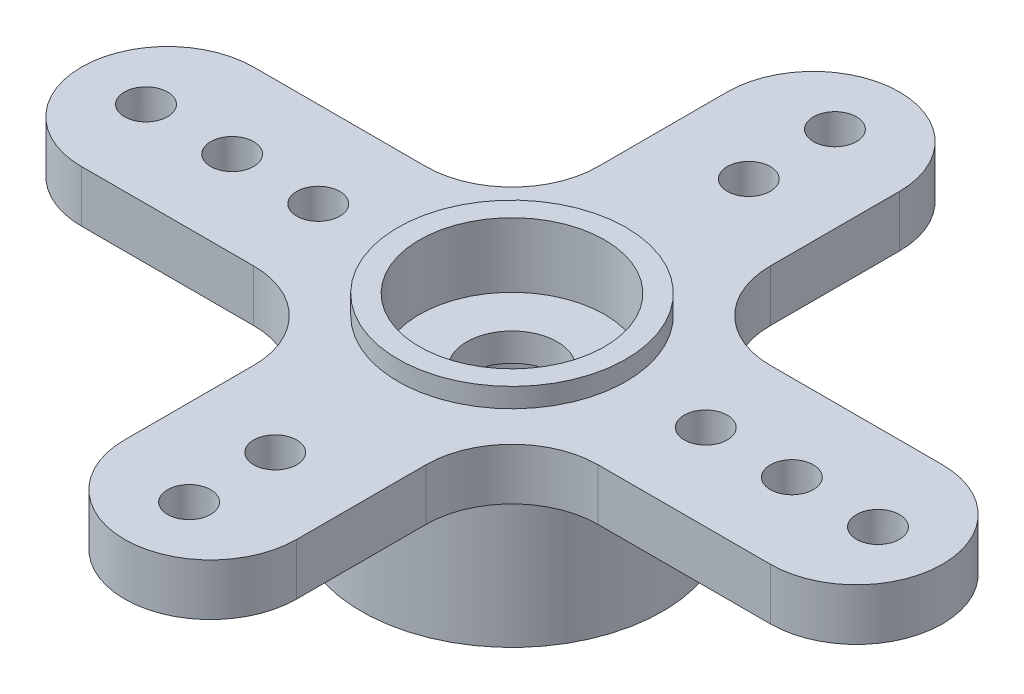
ISO-10303-21;
HEADER;
FILE_DESCRIPTION(('STEP AP214'),'2;1');
FILE_NAME('part.step','',(''),(''),'','','');
FILE_SCHEMA(('AUTOMOTIVE_DESIGN { 1 0 10303 214 1 1 1 1 }'));
ENDSEC;
DATA;
#1=APPLICATION_CONTEXT('core data for automotive mechanical design processes');
#2=APPLICATION_PROTOCOL_DEFINITION('international standard','automotive_design',2000,#1);
#3=PRODUCT_CONTEXT('',#1,'mechanical');
#4=PRODUCT('Part','Part','',(#3));
#5=PRODUCT_RELATED_PRODUCT_CATEGORY('part','',(#4));
#6=PRODUCT_DEFINITION_FORMATION('','',#4);
#7=PRODUCT_DEFINITION_CONTEXT('part definition',#1,'design');
#8=PRODUCT_DEFINITION('design','',#6,#7);
#9=PRODUCT_DEFINITION_SHAPE('','',#8);
#10=(LENGTH_UNIT() NAMED_UNIT(*) SI_UNIT(.MILLI.,.METRE.));
#11=(NAMED_UNIT(*) PLANE_ANGLE_UNIT() SI_UNIT($,.RADIAN.));
#12=(NAMED_UNIT(*) SI_UNIT($,.STERADIAN.) SOLID_ANGLE_UNIT());
#13=UNCERTAINTY_MEASURE_WITH_UNIT(LENGTH_MEASURE(1.E-05),#10,'distance_accuracy_value','');
#14=(GEOMETRIC_REPRESENTATION_CONTEXT(3) GLOBAL_UNCERTAINTY_ASSIGNED_CONTEXT((#13)) GLOBAL_UNIT_ASSIGNED_CONTEXT((#10,
#11,#12)) REPRESENTATION_CONTEXT('',''));
#15=CARTESIAN_POINT('',(0.,0.,0.));
#16=DIRECTION('',(0.,0.,1.));
#17=DIRECTION('',(1.,0.,0.));
#18=AXIS2_PLACEMENT_3D('',#15,#16,#17);
#19=CARTESIAN_POINT('',(3.5,0.500000000000001,0.));
#20=DIRECTION('',(0.,-1.,0.));
#21=DIRECTION('',(0.,0.,-1.));
#22=AXIS2_PLACEMENT_3D('',#19,#20,#21);
#23=PLANE('',#22);
#24=CARTESIAN_POINT('',(0.,0.5,0.));
#25=DIRECTION('',(0.,-1.,0.));
#26=DIRECTION('',(0.,0.,-1.));
#27=AXIS2_PLACEMENT_3D('',#24,#25,#26);
#28=CIRCLE('',#27,3.5);
#29=CARTESIAN_POINT('',(0.,0.5,-3.5));
#30=VERTEX_POINT('',#29);
#31=EDGE_CURVE('E213',#30,#30,#28,.T.);
#32=ORIENTED_EDGE('',*,*,#31,.F.);
#33=EDGE_LOOP('',(#32));
#34=FACE_BOUND('',#33,.T.);
#35=CARTESIAN_POINT('',(-6.5,0.500000000000001,0.));
#36=DIRECTION('',(0.,-1.,0.));
#37=DIRECTION('',(0.,0.,-1.));
#38=AXIS2_PLACEMENT_3D('',#35,#36,#37);
#39=CIRCLE('',#38,0.499999999999929);
#40=CARTESIAN_POINT('',(-6.5,0.500000000000001,-0.499999999999929));
#41=VERTEX_POINT('',#40);
#42=EDGE_CURVE('E237',#41,#41,#39,.T.);
#43=ORIENTED_EDGE('',*,*,#42,.F.);
#44=EDGE_LOOP('',(#43));
#45=FACE_BOUND('',#44,.T.);
#46=CARTESIAN_POINT('',(-4.5,0.500000000000001,0.));
#47=DIRECTION('',(0.,-1.,0.));
#48=DIRECTION('',(0.,0.,-1.));
#49=AXIS2_PLACEMENT_3D('',#46,#47,#48);
#50=CIRCLE('',#49,0.499999999999929);
#51=CARTESIAN_POINT('',(-4.5,0.500000000000001,-0.499999999999929));
#52=VERTEX_POINT('',#51);
#53=EDGE_CURVE('E243',#52,#52,#50,.T.);
#54=ORIENTED_EDGE('',*,*,#53,.F.);
#55=EDGE_LOOP('',(#54));
#56=FACE_BOUND('',#55,.T.);
#57=CARTESIAN_POINT('',(-8.5,0.500000000000001,0.));
#58=DIRECTION('',(0.,-1.,0.));
#59=DIRECTION('',(0.,0.,-1.));
#60=AXIS2_PLACEMENT_3D('',#57,#58,#59);
#61=CIRCLE('',#60,0.499999999999928);
#62=CARTESIAN_POINT('',(-8.5,0.500000000000001,-0.499999999999928));
#63=VERTEX_POINT('',#62);
#64=EDGE_CURVE('E249',#63,#63,#61,.T.);
#65=ORIENTED_EDGE('',*,*,#64,.F.);
#66=EDGE_LOOP('',(#65));
#67=FACE_BOUND('',#66,.T.);
#68=CARTESIAN_POINT('',(6.5,0.500000000000001,0.));
#69=DIRECTION('',(0.,-1.,0.));
#70=DIRECTION('',(0.,0.,-1.));
#71=AXIS2_PLACEMENT_3D('',#68,#69,#70);
#72=CIRCLE('',#71,0.499999999999929);
#73=CARTESIAN_POINT('',(6.5,0.500000000000001,-0.499999999999929));
#74=VERTEX_POINT('',#73);
#75=EDGE_CURVE('E255',#74,#74,#72,.T.);
#76=ORIENTED_EDGE('',*,*,#75,.F.);
#77=EDGE_LOOP('',(#76));
#78=FACE_BOUND('',#77,.T.);
#79=CARTESIAN_POINT('',(4.5,0.500000000000001,0.));
#80=DIRECTION('',(0.,-1.,0.));
#81=DIRECTION('',(0.,0.,-1.));
#82=AXIS2_PLACEMENT_3D('',#79,#80,#81);
#83=CIRCLE('',#82,0.499999999999929);
#84=CARTESIAN_POINT('',(4.5,0.500000000000001,-0.499999999999929));
#85=VERTEX_POINT('',#84);
#86=EDGE_CURVE('E261',#85,#85,#83,.T.);
#87=ORIENTED_EDGE('',*,*,#86,.F.);
#88=EDGE_LOOP('',(#87));
#89=FACE_BOUND('',#88,.T.);
#90=CARTESIAN_POINT('',(8.5,0.500000000000001,0.));
#91=DIRECTION('',(0.,-1.,0.));
#92=DIRECTION('',(0.,0.,-1.));
#93=AXIS2_PLACEMENT_3D('',#90,#91,#92);
#94=CIRCLE('',#93,0.499999999999928);
#95=CARTESIAN_POINT('',(8.5,0.500000000000001,-0.499999999999928));
#96=VERTEX_POINT('',#95);
#97=EDGE_CURVE('E267',#96,#96,#94,.T.);
#98=ORIENTED_EDGE('',*,*,#97,.F.);
#99=EDGE_LOOP('',(#98));
#100=FACE_BOUND('',#99,.T.);
#101=CARTESIAN_POINT('',(0.,0.500000000000001,-7.5));
#102=DIRECTION('',(0.,-1.,0.));
#103=DIRECTION('',(0.,0.,-1.));
#104=AXIS2_PLACEMENT_3D('',#101,#102,#103);
#105=CIRCLE('',#104,0.499999999999966);
#106=CARTESIAN_POINT('',(0.,0.500000000000001,-7.99999999999997));
#107=VERTEX_POINT('',#106);
#108=EDGE_CURVE('E273',#107,#107,#105,.T.);
#109=ORIENTED_EDGE('',*,*,#108,.F.);
#110=EDGE_LOOP('',(#109));
#111=FACE_BOUND('',#110,.T.);
#112=CARTESIAN_POINT('',(0.,0.500000000000001,-5.5));
#113=DIRECTION('',(0.,-1.,0.));
#114=DIRECTION('',(0.,0.,-1.));
#115=AXIS2_PLACEMENT_3D('',#112,#113,#114);
#116=CIRCLE('',#115,0.499999999999966);
#117=CARTESIAN_POINT('',(0.,0.500000000000001,-5.99999999999997));
#118=VERTEX_POINT('',#117);
#119=EDGE_CURVE('E279',#118,#118,#116,.T.);
#120=ORIENTED_EDGE('',*,*,#119,.F.);
#121=EDGE_LOOP('',(#120));
#122=FACE_BOUND('',#121,.T.);
#123=CARTESIAN_POINT('',(0.,0.500000000000001,7.5));
#124=DIRECTION('',(0.,-1.,0.));
#125=DIRECTION('',(0.,0.,-1.));
#126=AXIS2_PLACEMENT_3D('',#123,#124,#125);
#127=CIRCLE('',#126,0.499999999999966);
#128=CARTESIAN_POINT('',(0.,0.500000000000001,7.00000000000003));
#129=VERTEX_POINT('',#128);
#130=EDGE_CURVE('E285',#129,#129,#127,.T.);
#131=ORIENTED_EDGE('',*,*,#130,.F.);
#132=EDGE_LOOP('',(#131));
#133=FACE_BOUND('',#132,.T.);
#134=CARTESIAN_POINT('',(0.,0.500000000000001,5.5));
#135=DIRECTION('',(0.,-1.,0.));
#136=DIRECTION('',(0.,0.,-1.));
#137=AXIS2_PLACEMENT_3D('',#134,#135,#136);
#138=CIRCLE('',#137,0.499999999999966);
#139=CARTESIAN_POINT('',(0.,0.500000000000001,5.00000000000003));
#140=VERTEX_POINT('',#139);
#141=EDGE_CURVE('E291',#140,#140,#138,.T.);
#142=ORIENTED_EDGE('',*,*,#141,.F.);
#143=EDGE_LOOP('',(#142));
#144=FACE_BOUND('',#143,.T.);
#145=DIRECTION('',(-1.,0.,0.));
#146=VECTOR('',#145,1.);
#147=CARTESIAN_POINT('',(3.5,0.500000000000001,2.));
#148=LINE('',#147,#146);
#149=CARTESIAN_POINT('',(8.,0.5,2.));
#150=VERTEX_POINT('',#149);
#151=CARTESIAN_POINT('',(4.,0.500000000000001,2.));
#152=VERTEX_POINT('',#151);
#153=EDGE_CURVE('E340',#150,#152,#148,.T.);
#154=ORIENTED_EDGE('',*,*,#153,.T.);
#155=CARTESIAN_POINT('',(4.,0.5,4.));
#156=DIRECTION('',(0.,-1.,0.));
#157=DIRECTION('',(0.,0.,-1.));
#158=AXIS2_PLACEMENT_3D('',#155,#156,#157);
#159=CIRCLE('',#158,2.);
#160=CARTESIAN_POINT('',(2.,0.5,4.));
#161=VERTEX_POINT('',#160);
#162=EDGE_CURVE('E162',#152,#161,#159,.F.);
#163=ORIENTED_EDGE('',*,*,#162,.T.);
#164=DIRECTION('',(0.,0.,1.));
#165=VECTOR('',#164,1.);
#166=CARTESIAN_POINT('',(2.,0.500000000000001,0.));
#167=LINE('',#166,#165);
#168=CARTESIAN_POINT('',(2.,0.5,7.));
#169=VERTEX_POINT('',#168);
#170=EDGE_CURVE('E298',#161,#169,#167,.T.);
#171=ORIENTED_EDGE('',*,*,#170,.T.);
#172=CARTESIAN_POINT('',(0.,0.5,7.));
#173=DIRECTION('',(0.,-1.,0.));
#174=DIRECTION('',(0.,0.,-1.));
#175=AXIS2_PLACEMENT_3D('',#172,#173,#174);
#176=CIRCLE('',#175,2.);
#177=CARTESIAN_POINT('',(-2.,0.5,7.));
#178=VERTEX_POINT('',#177);
#179=EDGE_CURVE('E301',#169,#178,#176,.T.);
#180=ORIENTED_EDGE('',*,*,#179,.T.);
#181=DIRECTION('',(0.,0.,-1.));
#182=VECTOR('',#181,1.);
#183=CARTESIAN_POINT('',(-2.,0.500000000000001,0.));
#184=LINE('',#183,#182);
#185=CARTESIAN_POINT('',(-2.,0.5,4.));
#186=VERTEX_POINT('',#185);
#187=EDGE_CURVE('E304',#178,#186,#184,.T.);
#188=ORIENTED_EDGE('',*,*,#187,.T.);
#189=CARTESIAN_POINT('',(-4.,0.5,4.));
#190=DIRECTION('',(0.,-1.,0.));
#191=DIRECTION('',(0.,0.,-1.));
#192=AXIS2_PLACEMENT_3D('',#189,#190,#191);
#193=CIRCLE('',#192,2.);
#194=CARTESIAN_POINT('',(-4.,0.5,2.));
#195=VERTEX_POINT('',#194);
#196=EDGE_CURVE('E307',#186,#195,#193,.F.);
#197=ORIENTED_EDGE('',*,*,#196,.T.);
#198=DIRECTION('',(-1.,0.,0.));
#199=VECTOR('',#198,1.);
#200=CARTESIAN_POINT('',(3.5,0.500000000000001,2.));
#201=LINE('',#200,#199);
#202=CARTESIAN_POINT('',(-8.,0.5,2.));
#203=VERTEX_POINT('',#202);
#204=EDGE_CURVE('E310',#195,#203,#201,.T.);
#205=ORIENTED_EDGE('',*,*,#204,.T.);
#206=CARTESIAN_POINT('',(-8.,0.5,0.));
#207=DIRECTION('',(0.,-1.,0.));
#208=DIRECTION('',(0.,0.,-1.));
#209=AXIS2_PLACEMENT_3D('',#206,#207,#208);
#210=CIRCLE('',#209,2.);
#211=CARTESIAN_POINT('',(-8.,0.5,-2.));
#212=VERTEX_POINT('',#211);
#213=EDGE_CURVE('E313',#203,#212,#210,.T.);
#214=ORIENTED_EDGE('',*,*,#213,.T.);
#215=DIRECTION('',(1.,0.,0.));
#216=VECTOR('',#215,1.);
#217=CARTESIAN_POINT('',(3.5,0.500000000000001,-2.));
#218=LINE('',#217,#216);
#219=CARTESIAN_POINT('',(-4.,0.5,-2.));
#220=VERTEX_POINT('',#219);
#221=EDGE_CURVE('E316',#212,#220,#218,.T.);
#222=ORIENTED_EDGE('',*,*,#221,.T.);
#223=CARTESIAN_POINT('',(-4.,0.5,-4.));
#224=DIRECTION('',(0.,-1.,0.));
#225=DIRECTION('',(0.,0.,-1.));
#226=AXIS2_PLACEMENT_3D('',#223,#224,#225);
#227=CIRCLE('',#226,2.);
#228=CARTESIAN_POINT('',(-2.,0.5,-4.));
#229=VERTEX_POINT('',#228);
#230=EDGE_CURVE('E319',#220,#229,#227,.F.);
#231=ORIENTED_EDGE('',*,*,#230,.T.);
#232=DIRECTION('',(0.,0.,-1.));
#233=VECTOR('',#232,1.);
#234=CARTESIAN_POINT('',(-2.,0.500000000000001,0.));
#235=LINE('',#234,#233);
#236=CARTESIAN_POINT('',(-2.,0.5,-7.));
#237=VERTEX_POINT('',#236);
#238=EDGE_CURVE('E322',#229,#237,#235,.T.);
#239=ORIENTED_EDGE('',*,*,#238,.T.);
#240=CARTESIAN_POINT('',(0.,0.5,-7.));
#241=DIRECTION('',(0.,-1.,0.));
#242=DIRECTION('',(0.,0.,-1.));
#243=AXIS2_PLACEMENT_3D('',#240,#241,#242);
#244=CIRCLE('',#243,2.);
#245=CARTESIAN_POINT('',(2.,0.5,-7.));
#246=VERTEX_POINT('',#245);
#247=EDGE_CURVE('E325',#237,#246,#244,.T.);
#248=ORIENTED_EDGE('',*,*,#247,.T.);
#249=DIRECTION('',(0.,0.,1.));
#250=VECTOR('',#249,1.);
#251=CARTESIAN_POINT('',(2.,0.500000000000001,0.));
#252=LINE('',#251,#250);
#253=CARTESIAN_POINT('',(2.,0.5,-4.));
#254=VERTEX_POINT('',#253);
#255=EDGE_CURVE('E328',#246,#254,#252,.T.);
#256=ORIENTED_EDGE('',*,*,#255,.T.);
#257=CARTESIAN_POINT('',(4.,0.5,-4.));
#258=DIRECTION('',(0.,-1.,0.));
#259=DIRECTION('',(0.,0.,-1.));
#260=AXIS2_PLACEMENT_3D('',#257,#258,#259);
#261=CIRCLE('',#260,2.);
#262=CARTESIAN_POINT('',(4.,0.5,-2.));
#263=VERTEX_POINT('',#262);
#264=EDGE_CURVE('E331',#254,#263,#261,.F.);
#265=ORIENTED_EDGE('',*,*,#264,.T.);
#266=DIRECTION('',(1.,0.,0.));
#267=VECTOR('',#266,1.);
#268=CARTESIAN_POINT('',(3.5,0.500000000000001,-2.));
#269=LINE('',#268,#267);
#270=CARTESIAN_POINT('',(8.,0.5,-2.));
#271=VERTEX_POINT('',#270);
#272=EDGE_CURVE('E334',#263,#271,#269,.T.);
#273=ORIENTED_EDGE('',*,*,#272,.T.);
#274=CARTESIAN_POINT('',(8.,0.5,0.));
#275=DIRECTION('',(0.,-1.,0.));
#276=DIRECTION('',(0.,0.,-1.));
#277=AXIS2_PLACEMENT_3D('',#274,#275,#276);
#278=CIRCLE('',#277,2.);
#279=EDGE_CURVE('E337',#271,#150,#278,.T.);
#280=ORIENTED_EDGE('',*,*,#279,.T.);
#281=EDGE_LOOP('',(#154,#163,#171,#180,#188,#197,#205,#214,#222,#231,#239,#248,#256,#265,#273,#280));
#282=FACE_BOUND('',#281,.T.);
#283=ADVANCED_FACE('F40',(#34,#45,#56,#67,#78,#89,#100,#111,#122,#133,#144,#282),#23,.T.);
#284=CARTESIAN_POINT('',(25.,1.7,0.));
#285=DIRECTION('',(0.,1.,0.));
#286=DIRECTION('',(0.,0.,1.));
#287=AXIS2_PLACEMENT_3D('',#284,#285,#286);
#288=PLANE('',#287);
#289=CARTESIAN_POINT('',(0.,1.7,0.));
#290=DIRECTION('',(0.,-1.,0.));
#291=DIRECTION('',(0.,0.,-1.));
#292=AXIS2_PLACEMENT_3D('',#289,#290,#291);
#293=CIRCLE('',#292,2.65);
#294=CARTESIAN_POINT('',(0.,1.7,-2.65));
#295=VERTEX_POINT('',#294);
#296=EDGE_CURVE('E216',#295,#295,#293,.T.);
#297=ORIENTED_EDGE('',*,*,#296,.T.);
#298=EDGE_LOOP('',(#297));
#299=FACE_BOUND('',#298,.T.);
#300=CARTESIAN_POINT('',(-6.5,1.7,0.));
#301=DIRECTION('',(0.,1.,0.));
#302=DIRECTION('',(0.,0.,1.));
#303=AXIS2_PLACEMENT_3D('',#300,#301,#302);
#304=CIRCLE('',#303,0.499999999999953);
#305=CARTESIAN_POINT('',(-6.5,1.7,0.499999999999953));
#306=VERTEX_POINT('',#305);
#307=EDGE_CURVE('E240',#306,#306,#304,.T.);
#308=ORIENTED_EDGE('',*,*,#307,.F.);
#309=EDGE_LOOP('',(#308));
#310=FACE_BOUND('',#309,.T.);
#311=CARTESIAN_POINT('',(-4.5,1.7,0.));
#312=DIRECTION('',(0.,1.,0.));
#313=DIRECTION('',(0.,0.,1.));
#314=AXIS2_PLACEMENT_3D('',#311,#312,#313);
#315=CIRCLE('',#314,0.499999999999953);
#316=CARTESIAN_POINT('',(-4.5,1.7,0.499999999999953));
#317=VERTEX_POINT('',#316);
#318=EDGE_CURVE('E246',#317,#317,#315,.T.);
#319=ORIENTED_EDGE('',*,*,#318,.F.);
#320=EDGE_LOOP('',(#319));
#321=FACE_BOUND('',#320,.T.);
#322=CARTESIAN_POINT('',(-8.5,1.7,0.));
#323=DIRECTION('',(0.,1.,0.));
#324=DIRECTION('',(0.,0.,1.));
#325=AXIS2_PLACEMENT_3D('',#322,#323,#324);
#326=CIRCLE('',#325,0.499999999999952);
#327=CARTESIAN_POINT('',(-8.5,1.7,0.499999999999952));
#328=VERTEX_POINT('',#327);
#329=EDGE_CURVE('E252',#328,#328,#326,.T.);
#330=ORIENTED_EDGE('',*,*,#329,.F.);
#331=EDGE_LOOP('',(#330));
#332=FACE_BOUND('',#331,.T.);
#333=CARTESIAN_POINT('',(6.5,1.7,0.));
#334=DIRECTION('',(0.,1.,0.));
#335=DIRECTION('',(0.,0.,1.));
#336=AXIS2_PLACEMENT_3D('',#333,#334,#335);
#337=CIRCLE('',#336,0.499999999999953);
#338=CARTESIAN_POINT('',(6.5,1.7,0.499999999999953));
#339=VERTEX_POINT('',#338);
#340=EDGE_CURVE('E258',#339,#339,#337,.T.);
#341=ORIENTED_EDGE('',*,*,#340,.F.);
#342=EDGE_LOOP('',(#341));
#343=FACE_BOUND('',#342,.T.);
#344=CARTESIAN_POINT('',(4.5,1.7,0.));
#345=DIRECTION('',(0.,1.,0.));
#346=DIRECTION('',(0.,0.,1.));
#347=AXIS2_PLACEMENT_3D('',#344,#345,#346);
#348=CIRCLE('',#347,0.499999999999953);
#349=CARTESIAN_POINT('',(4.5,1.7,0.499999999999953));
#350=VERTEX_POINT('',#349);
#351=EDGE_CURVE('E264',#350,#350,#348,.T.);
#352=ORIENTED_EDGE('',*,*,#351,.F.);
#353=EDGE_LOOP('',(#352));
#354=FACE_BOUND('',#353,.T.);
#355=CARTESIAN_POINT('',(8.5,1.7,0.));
#356=DIRECTION('',(0.,1.,0.));
#357=DIRECTION('',(0.,0.,1.));
#358=AXIS2_PLACEMENT_3D('',#355,#356,#357);
#359=CIRCLE('',#358,0.499999999999952);
#360=CARTESIAN_POINT('',(8.5,1.7,0.499999999999952));
#361=VERTEX_POINT('',#360);
#362=EDGE_CURVE('E270',#361,#361,#359,.T.);
#363=ORIENTED_EDGE('',*,*,#362,.F.);
#364=EDGE_LOOP('',(#363));
#365=FACE_BOUND('',#364,.T.);
#366=CARTESIAN_POINT('',(0.,1.7,-7.5));
#367=DIRECTION('',(0.,1.,0.));
#368=DIRECTION('',(0.,0.,1.));
#369=AXIS2_PLACEMENT_3D('',#366,#367,#368);
#370=CIRCLE('',#369,0.49999999999999);
#371=CARTESIAN_POINT('',(0.,1.7,-7.00000000000001));
#372=VERTEX_POINT('',#371);
#373=EDGE_CURVE('E276',#372,#372,#370,.T.);
#374=ORIENTED_EDGE('',*,*,#373,.F.);
#375=EDGE_LOOP('',(#374));
#376=FACE_BOUND('',#375,.T.);
#377=CARTESIAN_POINT('',(0.,1.7,-5.5));
#378=DIRECTION('',(0.,1.,0.));
#379=DIRECTION('',(0.,0.,1.));
#380=AXIS2_PLACEMENT_3D('',#377,#378,#379);
#381=CIRCLE('',#380,0.49999999999999);
#382=CARTESIAN_POINT('',(0.,1.7,-5.00000000000001));
#383=VERTEX_POINT('',#382);
#384=EDGE_CURVE('E282',#383,#383,#381,.T.);
#385=ORIENTED_EDGE('',*,*,#384,.F.);
#386=EDGE_LOOP('',(#385));
#387=FACE_BOUND('',#386,.T.);
#388=CARTESIAN_POINT('',(0.,1.7,7.5));
#389=DIRECTION('',(0.,1.,0.));
#390=DIRECTION('',(0.,0.,1.));
#391=AXIS2_PLACEMENT_3D('',#388,#389,#390);
#392=CIRCLE('',#391,0.49999999999999);
#393=CARTESIAN_POINT('',(0.,1.7,7.99999999999999));
#394=VERTEX_POINT('',#393);
#395=EDGE_CURVE('E288',#394,#394,#392,.T.);
#396=ORIENTED_EDGE('',*,*,#395,.F.);
#397=EDGE_LOOP('',(#396));
#398=FACE_BOUND('',#397,.T.);
#399=CARTESIAN_POINT('',(0.,1.7,5.5));
#400=DIRECTION('',(0.,1.,0.));
#401=DIRECTION('',(0.,0.,1.));
#402=AXIS2_PLACEMENT_3D('',#399,#400,#401);
#403=CIRCLE('',#402,0.49999999999999);
#404=CARTESIAN_POINT('',(0.,1.7,5.99999999999999));
#405=VERTEX_POINT('',#404);
#406=EDGE_CURVE('E294',#405,#405,#403,.T.);
#407=ORIENTED_EDGE('',*,*,#406,.F.);
#408=EDGE_LOOP('',(#407));
#409=FACE_BOUND('',#408,.T.);
#410=DIRECTION('',(0.,0.,-1.));
#411=VECTOR('',#410,1.);
#412=CARTESIAN_POINT('',(2.,1.7,0.));
#413=LINE('',#412,#411);
#414=CARTESIAN_POINT('',(2.,1.7,7.));
#415=VERTEX_POINT('',#414);
#416=CARTESIAN_POINT('',(2.,1.7,4.));
#417=VERTEX_POINT('',#416);
#418=EDGE_CURVE('E48',#415,#417,#413,.T.);
#419=ORIENTED_EDGE('',*,*,#418,.T.);
#420=CARTESIAN_POINT('',(4.,1.7,4.));
#421=DIRECTION('',(0.,1.,0.));
#422=DIRECTION('',(0.,0.,1.));
#423=AXIS2_PLACEMENT_3D('',#420,#421,#422);
#424=CIRCLE('',#423,2.);
#425=CARTESIAN_POINT('',(4.,1.7,2.));
#426=VERTEX_POINT('',#425);
#427=EDGE_CURVE('E12',#417,#426,#424,.F.);
#428=ORIENTED_EDGE('',*,*,#427,.T.);
#429=DIRECTION('',(1.,0.,0.));
#430=VECTOR('',#429,1.);
#431=CARTESIAN_POINT('',(25.,1.7,2.00000000000001));
#432=LINE('',#431,#430);
#433=CARTESIAN_POINT('',(8.,1.7,2.));
#434=VERTEX_POINT('',#433);
#435=EDGE_CURVE('E150',#426,#434,#432,.T.);
#436=ORIENTED_EDGE('',*,*,#435,.T.);
#437=CARTESIAN_POINT('',(8.,1.7,0.));
#438=DIRECTION('',(0.,1.,0.));
#439=DIRECTION('',(0.,0.,1.));
#440=AXIS2_PLACEMENT_3D('',#437,#438,#439);
#441=CIRCLE('',#440,2.);
#442=CARTESIAN_POINT('',(8.,1.7,-2.));
#443=VERTEX_POINT('',#442);
#444=EDGE_CURVE('E154',#434,#443,#441,.T.);
#445=ORIENTED_EDGE('',*,*,#444,.T.);
#446=DIRECTION('',(-1.,0.,0.));
#447=VECTOR('',#446,1.);
#448=CARTESIAN_POINT('',(25.,1.7,-2.00000000000001));
#449=LINE('',#448,#447);
#450=CARTESIAN_POINT('',(4.,1.7,-2.));
#451=VERTEX_POINT('',#450);
#452=EDGE_CURVE('E204',#443,#451,#449,.T.);
#453=ORIENTED_EDGE('',*,*,#452,.T.);
#454=CARTESIAN_POINT('',(4.,1.7,-4.));
#455=DIRECTION('',(0.,1.,0.));
#456=DIRECTION('',(0.,0.,1.));
#457=AXIS2_PLACEMENT_3D('',#454,#455,#456);
#458=CIRCLE('',#457,2.);
#459=CARTESIAN_POINT('',(2.,1.7,-4.));
#460=VERTEX_POINT('',#459);
#461=EDGE_CURVE('E201',#451,#460,#458,.F.);
#462=ORIENTED_EDGE('',*,*,#461,.T.);
#463=DIRECTION('',(0.,0.,-1.));
#464=VECTOR('',#463,1.);
#465=CARTESIAN_POINT('',(2.,1.7,0.));
#466=LINE('',#465,#464);
#467=CARTESIAN_POINT('',(2.,1.7,-7.));
#468=VERTEX_POINT('',#467);
#469=EDGE_CURVE('E198',#460,#468,#466,.T.);
#470=ORIENTED_EDGE('',*,*,#469,.T.);
#471=CARTESIAN_POINT('',(0.,1.7,-7.));
#472=DIRECTION('',(0.,1.,0.));
#473=DIRECTION('',(0.,0.,1.));
#474=AXIS2_PLACEMENT_3D('',#471,#472,#473);
#475=CIRCLE('',#474,2.);
#476=CARTESIAN_POINT('',(-2.,1.7,-7.));
#477=VERTEX_POINT('',#476);
#478=EDGE_CURVE('E195',#468,#477,#475,.T.);
#479=ORIENTED_EDGE('',*,*,#478,.T.);
#480=DIRECTION('',(0.,0.,1.));
#481=VECTOR('',#480,1.);
#482=CARTESIAN_POINT('',(-2.,1.7,0.));
#483=LINE('',#482,#481);
#484=CARTESIAN_POINT('',(-2.,1.7,-4.));
#485=VERTEX_POINT('',#484);
#486=EDGE_CURVE('E192',#477,#485,#483,.T.);
#487=ORIENTED_EDGE('',*,*,#486,.T.);
#488=CARTESIAN_POINT('',(-4.,1.7,-4.));
#489=DIRECTION('',(0.,1.,0.));
#490=DIRECTION('',(0.,0.,1.));
#491=AXIS2_PLACEMENT_3D('',#488,#489,#490);
#492=CIRCLE('',#491,2.);
#493=CARTESIAN_POINT('',(-4.,1.7,-2.));
#494=VERTEX_POINT('',#493);
#495=EDGE_CURVE('E189',#485,#494,#492,.F.);
#496=ORIENTED_EDGE('',*,*,#495,.T.);
#497=DIRECTION('',(-1.,0.,0.));
#498=VECTOR('',#497,1.);
#499=CARTESIAN_POINT('',(25.,1.7,-2.));
#500=LINE('',#499,#498);
#501=CARTESIAN_POINT('',(-8.,1.7,-2.));
#502=VERTEX_POINT('',#501);
#503=EDGE_CURVE('E186',#494,#502,#500,.T.);
#504=ORIENTED_EDGE('',*,*,#503,.T.);
#505=CARTESIAN_POINT('',(-8.,1.7,0.));
#506=DIRECTION('',(0.,1.,0.));
#507=DIRECTION('',(0.,0.,1.));
#508=AXIS2_PLACEMENT_3D('',#505,#506,#507);
#509=CIRCLE('',#508,2.);
#510=CARTESIAN_POINT('',(-8.,1.7,2.));
#511=VERTEX_POINT('',#510);
#512=EDGE_CURVE('E183',#502,#511,#509,.T.);
#513=ORIENTED_EDGE('',*,*,#512,.T.);
#514=DIRECTION('',(1.,0.,0.));
#515=VECTOR('',#514,1.);
#516=CARTESIAN_POINT('',(25.,1.7,2.));
#517=LINE('',#516,#515);
#518=CARTESIAN_POINT('',(-4.,1.7,2.));
#519=VERTEX_POINT('',#518);
#520=EDGE_CURVE('E180',#511,#519,#517,.T.);
#521=ORIENTED_EDGE('',*,*,#520,.T.);
#522=CARTESIAN_POINT('',(-4.,1.7,4.));
#523=DIRECTION('',(0.,1.,0.));
#524=DIRECTION('',(0.,0.,1.));
#525=AXIS2_PLACEMENT_3D('',#522,#523,#524);
#526=CIRCLE('',#525,2.);
#527=CARTESIAN_POINT('',(-2.,1.7,4.));
#528=VERTEX_POINT('',#527);
#529=EDGE_CURVE('E177',#519,#528,#526,.F.);
#530=ORIENTED_EDGE('',*,*,#529,.T.);
#531=DIRECTION('',(0.,0.,1.));
#532=VECTOR('',#531,1.);
#533=CARTESIAN_POINT('',(-2.,1.7,0.));
#534=LINE('',#533,#532);
#535=CARTESIAN_POINT('',(-2.,1.7,7.));
#536=VERTEX_POINT('',#535);
#537=EDGE_CURVE('E173',#528,#536,#534,.T.);
#538=ORIENTED_EDGE('',*,*,#537,.T.);
#539=CARTESIAN_POINT('',(0.,1.7,7.));
#540=DIRECTION('',(0.,1.,0.));
#541=DIRECTION('',(0.,0.,1.));
#542=AXIS2_PLACEMENT_3D('',#539,#540,#541);
#543=CIRCLE('',#542,2.);
#544=EDGE_CURVE('E169',#536,#415,#543,.T.);
#545=ORIENTED_EDGE('',*,*,#544,.T.);
#546=EDGE_LOOP('',(#419,#428,#436,#445,#453,#462,#470,#479,#487,#496,#504,#513,#521,#530,#538,#545));
#547=FACE_BOUND('',#546,.T.);
#548=ADVANCED_FACE('F166',(#299,#310,#321,#332,#343,#354,#365,#376,#387,#398,#409,#547),#288,.T.);
#549=CARTESIAN_POINT('',(0.,-19.4580401394546,0.));
#550=DIRECTION('',(0.,-1.,0.));
#551=DIRECTION('',(0.,0.,-1.));
#552=AXIS2_PLACEMENT_3D('',#549,#550,#551);
#553=CYLINDRICAL_SURFACE('',#552,2.25);
#554=CARTESIAN_POINT('',(0.,-2.5,0.));
#555=DIRECTION('',(0.,-1.,0.));
#556=DIRECTION('',(0.,0.,-1.));
#557=AXIS2_PLACEMENT_3D('',#554,#555,#556);
#558=CIRCLE('',#557,2.25);
#559=CARTESIAN_POINT('',(0.,-2.5,-2.25));
#560=VERTEX_POINT('',#559);
#561=EDGE_CURVE('E155',#560,#560,#558,.T.);
#562=ORIENTED_EDGE('',*,*,#561,.T.);
#563=EDGE_LOOP('',(#562));
#564=FACE_BOUND('',#563,.T.);
#565=CARTESIAN_POINT('',(0.,0.,0.));
#566=DIRECTION('',(0.,-1.,0.));
#567=DIRECTION('',(0.,0.,-1.));
#568=AXIS2_PLACEMENT_3D('',#565,#566,#567);
#569=CIRCLE('',#568,2.25);
#570=CARTESIAN_POINT('',(0.,0.,-2.25));
#571=VERTEX_POINT('',#570);
#572=EDGE_CURVE('E234',#571,#571,#569,.T.);
#573=ORIENTED_EDGE('',*,*,#572,.F.);
#574=EDGE_LOOP('',(#573));
#575=FACE_BOUND('',#574,.T.);
#576=ADVANCED_FACE('F42',(#564,#575),#553,.F.);
#577=CARTESIAN_POINT('',(2.25,-2.5,0.));
#578=DIRECTION('',(0.,-1.,0.));
#579=DIRECTION('',(0.,0.,-1.));
#580=AXIS2_PLACEMENT_3D('',#577,#578,#579);
#581=PLANE('',#580);
#582=CARTESIAN_POINT('',(0.,-2.5,0.));
#583=DIRECTION('',(0.,-1.,0.));
#584=DIRECTION('',(0.,0.,-1.));
#585=AXIS2_PLACEMENT_3D('',#582,#583,#584);
#586=CIRCLE('',#585,3.5);
#587=CARTESIAN_POINT('',(0.,-2.5,-3.5));
#588=VERTEX_POINT('',#587);
#589=EDGE_CURVE('E210',#588,#588,#586,.T.);
#590=ORIENTED_EDGE('',*,*,#589,.T.);
#591=EDGE_LOOP('',(#590));
#592=FACE_BOUND('',#591,.T.);
#593=ORIENTED_EDGE('',*,*,#561,.F.);
#594=EDGE_LOOP('',(#593));
#595=FACE_BOUND('',#594,.T.);
#596=ADVANCED_FACE('F445',(#592,#595),#581,.T.);
#597=CARTESIAN_POINT('',(0.,-19.4580401394546,0.));
#598=DIRECTION('',(0.,-1.,0.));
#599=DIRECTION('',(0.,0.,-1.));
#600=AXIS2_PLACEMENT_3D('',#597,#598,#599);
#601=CYLINDRICAL_SURFACE('',#600,3.5);
#602=ORIENTED_EDGE('',*,*,#31,.T.);
#603=EDGE_LOOP('',(#602));
#604=FACE_BOUND('',#603,.T.);
#605=ORIENTED_EDGE('',*,*,#589,.F.);
#606=EDGE_LOOP('',(#605));
#607=FACE_BOUND('',#606,.T.);
#608=ADVANCED_FACE('F442',(#604,#607),#601,.T.);
#609=CARTESIAN_POINT('',(0.,-19.4580401394546,0.));
#610=DIRECTION('',(0.,-1.,0.));
#611=DIRECTION('',(0.,0.,-1.));
#612=AXIS2_PLACEMENT_3D('',#609,#610,#611);
#613=CYLINDRICAL_SURFACE('',#612,2.65);
#614=CARTESIAN_POINT('',(0.,2.15,0.));
#615=DIRECTION('',(0.,-1.,0.));
#616=DIRECTION('',(0.,0.,-1.));
#617=AXIS2_PLACEMENT_3D('',#614,#615,#616);
#618=CIRCLE('',#617,2.65);
#619=CARTESIAN_POINT('',(0.,2.15,-2.65));
#620=VERTEX_POINT('',#619);
#621=EDGE_CURVE('E219',#620,#620,#618,.T.);
#622=ORIENTED_EDGE('',*,*,#621,.T.);
#623=EDGE_LOOP('',(#622));
#624=FACE_BOUND('',#623,.T.);
#625=ORIENTED_EDGE('',*,*,#296,.F.);
#626=EDGE_LOOP('',(#625));
#627=FACE_BOUND('',#626,.T.);
#628=ADVANCED_FACE('F444',(#624,#627),#613,.T.);
#629=CARTESIAN_POINT('',(2.65,2.15,0.));
#630=DIRECTION('',(0.,1.,0.));
#631=DIRECTION('',(0.,0.,1.));
#632=AXIS2_PLACEMENT_3D('',#629,#630,#631);
#633=PLANE('',#632);
#634=CARTESIAN_POINT('',(0.,2.15,0.));
#635=DIRECTION('',(0.,-1.,0.));
#636=DIRECTION('',(0.,0.,-1.));
#637=AXIS2_PLACEMENT_3D('',#634,#635,#636);
#638=CIRCLE('',#637,2.15);
#639=CARTESIAN_POINT('',(0.,2.15,-2.15));
#640=VERTEX_POINT('',#639);
#641=EDGE_CURVE('E222',#640,#640,#638,.T.);
#642=ORIENTED_EDGE('',*,*,#641,.T.);
#643=EDGE_LOOP('',(#642));
#644=FACE_BOUND('',#643,.T.);
#645=ORIENTED_EDGE('',*,*,#621,.F.);
#646=EDGE_LOOP('',(#645));
#647=FACE_BOUND('',#646,.T.);
#648=ADVANCED_FACE('F481',(#644,#647),#633,.T.);
#649=CARTESIAN_POINT('',(0.,-19.4580401394546,0.));
#650=DIRECTION('',(0.,-1.,0.));
#651=DIRECTION('',(0.,0.,-1.));
#652=AXIS2_PLACEMENT_3D('',#649,#650,#651);
#653=CYLINDRICAL_SURFACE('',#652,2.15);
#654=CARTESIAN_POINT('',(0.,0.649999999999998,0.));
#655=DIRECTION('',(0.,-1.,0.));
#656=DIRECTION('',(0.,0.,-1.));
#657=AXIS2_PLACEMENT_3D('',#654,#655,#656);
#658=CIRCLE('',#657,2.15);
#659=CARTESIAN_POINT('',(0.,0.649999999999998,-2.15));
#660=VERTEX_POINT('',#659);
#661=EDGE_CURVE('E225',#660,#660,#658,.T.);
#662=ORIENTED_EDGE('',*,*,#661,.T.);
#663=EDGE_LOOP('',(#662));
#664=FACE_BOUND('',#663,.T.);
#665=ORIENTED_EDGE('',*,*,#641,.F.);
#666=EDGE_LOOP('',(#665));
#667=FACE_BOUND('',#666,.T.);
#668=ADVANCED_FACE('F475',(#664,#667),#653,.F.);
#669=CARTESIAN_POINT('',(2.15,0.649999999999997,0.));
#670=DIRECTION('',(0.,1.,0.));
#671=DIRECTION('',(0.,0.,1.));
#672=AXIS2_PLACEMENT_3D('',#669,#670,#671);
#673=PLANE('',#672);
#674=CARTESIAN_POINT('',(0.,0.649999999999998,0.));
#675=DIRECTION('',(0.,-1.,0.));
#676=DIRECTION('',(0.,0.,-1.));
#677=AXIS2_PLACEMENT_3D('',#674,#675,#676);
#678=CIRCLE('',#677,1.05);
#679=CARTESIAN_POINT('',(0.,0.649999999999998,-1.05));
#680=VERTEX_POINT('',#679);
#681=EDGE_CURVE('E228',#680,#680,#678,.T.);
#682=ORIENTED_EDGE('',*,*,#681,.T.);
#683=EDGE_LOOP('',(#682));
#684=FACE_BOUND('',#683,.T.);
#685=ORIENTED_EDGE('',*,*,#661,.F.);
#686=EDGE_LOOP('',(#685));
#687=FACE_BOUND('',#686,.T.);
#688=ADVANCED_FACE('F469',(#684,#687),#673,.T.);
#689=CARTESIAN_POINT('',(0.,-19.4580401394546,0.));
#690=DIRECTION('',(0.,-1.,0.));
#691=DIRECTION('',(0.,0.,-1.));
#692=AXIS2_PLACEMENT_3D('',#689,#690,#691);
#693=CYLINDRICAL_SURFACE('',#692,1.05);
#694=CARTESIAN_POINT('',(0.,0.,0.));
#695=DIRECTION('',(0.,-1.,0.));
#696=DIRECTION('',(0.,0.,-1.));
#697=AXIS2_PLACEMENT_3D('',#694,#695,#696);
#698=CIRCLE('',#697,1.05);
#699=CARTESIAN_POINT('',(0.,0.,-1.05));
#700=VERTEX_POINT('',#699);
#701=EDGE_CURVE('E231',#700,#700,#698,.T.);
#702=ORIENTED_EDGE('',*,*,#701,.T.);
#703=EDGE_LOOP('',(#702));
#704=FACE_BOUND('',#703,.T.);
#705=ORIENTED_EDGE('',*,*,#681,.F.);
#706=EDGE_LOOP('',(#705));
#707=FACE_BOUND('',#706,.T.);
#708=ADVANCED_FACE('F463',(#704,#707),#693,.F.);
#709=CARTESIAN_POINT('',(1.05,0.,0.));
#710=DIRECTION('',(0.,-1.,0.));
#711=DIRECTION('',(0.,0.,-1.));
#712=AXIS2_PLACEMENT_3D('',#709,#710,#711);
#713=PLANE('',#712);
#714=ORIENTED_EDGE('',*,*,#572,.T.);
#715=EDGE_LOOP('',(#714));
#716=FACE_BOUND('',#715,.T.);
#717=ORIENTED_EDGE('',*,*,#701,.F.);
#718=EDGE_LOOP('',(#717));
#719=FACE_BOUND('',#718,.T.);
#720=ADVANCED_FACE('F459',(#716,#719),#713,.T.);
#721=CARTESIAN_POINT('',(-6.5,1.7,0.));
#722=DIRECTION('',(0.,1.,0.));
#723=DIRECTION('',(0.,0.,1.));
#724=AXIS2_PLACEMENT_3D('',#721,#722,#723);
#725=CYLINDRICAL_SURFACE('',#724,0.499999999999929);
#726=ORIENTED_EDGE('',*,*,#42,.T.);
#727=EDGE_LOOP('',(#726));
#728=FACE_BOUND('',#727,.T.);
#729=ORIENTED_EDGE('',*,*,#307,.T.);
#730=EDGE_LOOP('',(#729));
#731=FACE_BOUND('',#730,.T.);
#732=ADVANCED_FACE('F462',(#728,#731),#725,.F.);
#733=CARTESIAN_POINT('',(-4.5,1.7,0.));
#734=DIRECTION('',(0.,1.,0.));
#735=DIRECTION('',(0.,0.,1.));
#736=AXIS2_PLACEMENT_3D('',#733,#734,#735);
#737=CYLINDRICAL_SURFACE('',#736,0.499999999999929);
#738=ORIENTED_EDGE('',*,*,#53,.T.);
#739=EDGE_LOOP('',(#738));
#740=FACE_BOUND('',#739,.T.);
#741=ORIENTED_EDGE('',*,*,#318,.T.);
#742=EDGE_LOOP('',(#741));
#743=FACE_BOUND('',#742,.T.);
#744=ADVANCED_FACE('F551',(#740,#743),#737,.F.);
#745=CARTESIAN_POINT('',(-8.5,1.7,0.));
#746=DIRECTION('',(0.,1.,0.));
#747=DIRECTION('',(0.,0.,1.));
#748=AXIS2_PLACEMENT_3D('',#745,#746,#747);
#749=CYLINDRICAL_SURFACE('',#748,0.499999999999928);
#750=ORIENTED_EDGE('',*,*,#64,.T.);
#751=EDGE_LOOP('',(#750));
#752=FACE_BOUND('',#751,.T.);
#753=ORIENTED_EDGE('',*,*,#329,.T.);
#754=EDGE_LOOP('',(#753));
#755=FACE_BOUND('',#754,.T.);
#756=ADVANCED_FACE('F547',(#752,#755),#749,.F.);
#757=CARTESIAN_POINT('',(6.5,1.7,0.));
#758=DIRECTION('',(0.,1.,0.));
#759=DIRECTION('',(0.,0.,1.));
#760=AXIS2_PLACEMENT_3D('',#757,#758,#759);
#761=CYLINDRICAL_SURFACE('',#760,0.499999999999929);
#762=ORIENTED_EDGE('',*,*,#75,.T.);
#763=EDGE_LOOP('',(#762));
#764=FACE_BOUND('',#763,.T.);
#765=ORIENTED_EDGE('',*,*,#340,.T.);
#766=EDGE_LOOP('',(#765));
#767=FACE_BOUND('',#766,.T.);
#768=ADVANCED_FACE('F543',(#764,#767),#761,.F.);
#769=CARTESIAN_POINT('',(4.5,1.7,0.));
#770=DIRECTION('',(0.,1.,0.));
#771=DIRECTION('',(0.,0.,1.));
#772=AXIS2_PLACEMENT_3D('',#769,#770,#771);
#773=CYLINDRICAL_SURFACE('',#772,0.499999999999929);
#774=ORIENTED_EDGE('',*,*,#86,.T.);
#775=EDGE_LOOP('',(#774));
#776=FACE_BOUND('',#775,.T.);
#777=ORIENTED_EDGE('',*,*,#351,.T.);
#778=EDGE_LOOP('',(#777));
#779=FACE_BOUND('',#778,.T.);
#780=ADVANCED_FACE('F539',(#776,#779),#773,.F.);
#781=CARTESIAN_POINT('',(8.5,1.7,0.));
#782=DIRECTION('',(0.,1.,0.));
#783=DIRECTION('',(0.,0.,1.));
#784=AXIS2_PLACEMENT_3D('',#781,#782,#783);
#785=CYLINDRICAL_SURFACE('',#784,0.499999999999928);
#786=ORIENTED_EDGE('',*,*,#97,.T.);
#787=EDGE_LOOP('',(#786));
#788=FACE_BOUND('',#787,.T.);
#789=ORIENTED_EDGE('',*,*,#362,.T.);
#790=EDGE_LOOP('',(#789));
#791=FACE_BOUND('',#790,.T.);
#792=ADVANCED_FACE('F535',(#788,#791),#785,.F.);
#793=CARTESIAN_POINT('',(0.,1.7,-7.5));
#794=DIRECTION('',(0.,1.,0.));
#795=DIRECTION('',(0.,0.,1.));
#796=AXIS2_PLACEMENT_3D('',#793,#794,#795);
#797=CYLINDRICAL_SURFACE('',#796,0.499999999999966);
#798=ORIENTED_EDGE('',*,*,#108,.T.);
#799=EDGE_LOOP('',(#798));
#800=FACE_BOUND('',#799,.T.);
#801=ORIENTED_EDGE('',*,*,#373,.T.);
#802=EDGE_LOOP('',(#801));
#803=FACE_BOUND('',#802,.T.);
#804=ADVANCED_FACE('F531',(#800,#803),#797,.F.);
#805=CARTESIAN_POINT('',(0.,1.7,-5.5));
#806=DIRECTION('',(0.,1.,0.));
#807=DIRECTION('',(0.,0.,1.));
#808=AXIS2_PLACEMENT_3D('',#805,#806,#807);
#809=CYLINDRICAL_SURFACE('',#808,0.499999999999966);
#810=ORIENTED_EDGE('',*,*,#119,.T.);
#811=EDGE_LOOP('',(#810));
#812=FACE_BOUND('',#811,.T.);
#813=ORIENTED_EDGE('',*,*,#384,.T.);
#814=EDGE_LOOP('',(#813));
#815=FACE_BOUND('',#814,.T.);
#816=ADVANCED_FACE('F524',(#812,#815),#809,.F.);
#817=CARTESIAN_POINT('',(0.,1.7,7.5));
#818=DIRECTION('',(0.,1.,0.));
#819=DIRECTION('',(0.,0.,1.));
#820=AXIS2_PLACEMENT_3D('',#817,#818,#819);
#821=CYLINDRICAL_SURFACE('',#820,0.499999999999966);
#822=ORIENTED_EDGE('',*,*,#130,.T.);
#823=EDGE_LOOP('',(#822));
#824=FACE_BOUND('',#823,.T.);
#825=ORIENTED_EDGE('',*,*,#395,.T.);
#826=EDGE_LOOP('',(#825));
#827=FACE_BOUND('',#826,.T.);
#828=ADVANCED_FACE('F516',(#824,#827),#821,.F.);
#829=CARTESIAN_POINT('',(0.,1.7,5.5));
#830=DIRECTION('',(0.,1.,0.));
#831=DIRECTION('',(0.,0.,1.));
#832=AXIS2_PLACEMENT_3D('',#829,#830,#831);
#833=CYLINDRICAL_SURFACE('',#832,0.499999999999966);
#834=ORIENTED_EDGE('',*,*,#141,.T.);
#835=EDGE_LOOP('',(#834));
#836=FACE_BOUND('',#835,.T.);
#837=ORIENTED_EDGE('',*,*,#406,.T.);
#838=EDGE_LOOP('',(#837));
#839=FACE_BOUND('',#838,.T.);
#840=ADVANCED_FACE('F514',(#836,#839),#833,.F.);
#841=CARTESIAN_POINT('',(4.,-2.5,4.));
#842=DIRECTION('',(0.,1.,0.));
#843=DIRECTION('',(0.,0.,1.));
#844=AXIS2_PLACEMENT_3D('',#841,#842,#843);
#845=CYLINDRICAL_SURFACE('',#844,2.);
#846=DIRECTION('',(0.,1.,0.));
#847=VECTOR('',#846,1.);
#848=CARTESIAN_POINT('',(4.,-2.5,2.));
#849=LINE('',#848,#847);
#850=EDGE_CURVE('E55',#152,#426,#849,.T.);
#851=ORIENTED_EDGE('',*,*,#850,.T.);
#852=ORIENTED_EDGE('',*,*,#427,.F.);
#853=DIRECTION('',(0.,1.,0.));
#854=VECTOR('',#853,1.);
#855=CARTESIAN_POINT('',(2.,-2.5,4.));
#856=LINE('',#855,#854);
#857=EDGE_CURVE('E341',#161,#417,#856,.T.);
#858=ORIENTED_EDGE('',*,*,#857,.F.);
#859=ORIENTED_EDGE('',*,*,#162,.F.);
#860=EDGE_LOOP('',(#851,#852,#858,#859));
#861=FACE_BOUND('',#860,.T.);
#862=ADVANCED_FACE('F158',(#861),#845,.F.);
#863=CARTESIAN_POINT('',(2.,-2.5,7.));
#864=DIRECTION('',(1.,0.,0.));
#865=DIRECTION('',(0.,0.,-1.));
#866=AXIS2_PLACEMENT_3D('',#863,#864,#865);
#867=PLANE('',#866);
#868=ORIENTED_EDGE('',*,*,#857,.T.);
#869=ORIENTED_EDGE('',*,*,#418,.F.);
#870=DIRECTION('',(0.,1.,0.));
#871=VECTOR('',#870,1.);
#872=CARTESIAN_POINT('',(2.,-2.5,7.));
#873=LINE('',#872,#871);
#874=EDGE_CURVE('E380',#169,#415,#873,.T.);
#875=ORIENTED_EDGE('',*,*,#874,.F.);
#876=ORIENTED_EDGE('',*,*,#170,.F.);
#877=EDGE_LOOP('',(#868,#869,#875,#876));
#878=FACE_BOUND('',#877,.T.);
#879=ADVANCED_FACE('F382',(#878),#867,.T.);
#880=CARTESIAN_POINT('',(0.,-2.5,7.));
#881=DIRECTION('',(0.,1.,0.));
#882=DIRECTION('',(0.,0.,1.));
#883=AXIS2_PLACEMENT_3D('',#880,#881,#882);
#884=CYLINDRICAL_SURFACE('',#883,2.);
#885=ORIENTED_EDGE('',*,*,#874,.T.);
#886=ORIENTED_EDGE('',*,*,#544,.F.);
#887=DIRECTION('',(0.,1.,0.));
#888=VECTOR('',#887,1.);
#889=CARTESIAN_POINT('',(-2.,-2.5,7.));
#890=LINE('',#889,#888);
#891=EDGE_CURVE('E377',#178,#536,#890,.T.);
#892=ORIENTED_EDGE('',*,*,#891,.F.);
#893=ORIENTED_EDGE('',*,*,#179,.F.);
#894=EDGE_LOOP('',(#885,#886,#892,#893));
#895=FACE_BOUND('',#894,.T.);
#896=ADVANCED_FACE('F421',(#895),#884,.T.);
#897=CARTESIAN_POINT('',(-2.,-2.5,7.));
#898=DIRECTION('',(-1.,0.,0.));
#899=DIRECTION('',(0.,0.,1.));
#900=AXIS2_PLACEMENT_3D('',#897,#898,#899);
#901=PLANE('',#900);
#902=ORIENTED_EDGE('',*,*,#891,.T.);
#903=ORIENTED_EDGE('',*,*,#537,.F.);
#904=DIRECTION('',(0.,1.,0.));
#905=VECTOR('',#904,1.);
#906=CARTESIAN_POINT('',(-2.,-2.5,4.));
#907=LINE('',#906,#905);
#908=EDGE_CURVE('E374',#186,#528,#907,.T.);
#909=ORIENTED_EDGE('',*,*,#908,.F.);
#910=ORIENTED_EDGE('',*,*,#187,.F.);
#911=EDGE_LOOP('',(#902,#903,#909,#910));
#912=FACE_BOUND('',#911,.T.);
#913=ADVANCED_FACE('F419',(#912),#901,.T.);
#914=CARTESIAN_POINT('',(-4.,-2.5,4.));
#915=DIRECTION('',(0.,1.,0.));
#916=DIRECTION('',(0.,0.,1.));
#917=AXIS2_PLACEMENT_3D('',#914,#915,#916);
#918=CYLINDRICAL_SURFACE('',#917,2.);
#919=ORIENTED_EDGE('',*,*,#908,.T.);
#920=ORIENTED_EDGE('',*,*,#529,.F.);
#921=DIRECTION('',(0.,1.,0.));
#922=VECTOR('',#921,1.);
#923=CARTESIAN_POINT('',(-4.,-2.5,2.));
#924=LINE('',#923,#922);
#925=EDGE_CURVE('E371',#195,#519,#924,.T.);
#926=ORIENTED_EDGE('',*,*,#925,.F.);
#927=ORIENTED_EDGE('',*,*,#196,.F.);
#928=EDGE_LOOP('',(#919,#920,#926,#927));
#929=FACE_BOUND('',#928,.T.);
#930=ADVANCED_FACE('F415',(#929),#918,.F.);
#931=CARTESIAN_POINT('',(-8.,-2.5,2.));
#932=DIRECTION('',(0.,0.,1.));
#933=DIRECTION('',(1.,0.,0.));
#934=AXIS2_PLACEMENT_3D('',#931,#932,#933);
#935=PLANE('',#934);
#936=ORIENTED_EDGE('',*,*,#925,.T.);
#937=ORIENTED_EDGE('',*,*,#520,.F.);
#938=DIRECTION('',(0.,1.,0.));
#939=VECTOR('',#938,1.);
#940=CARTESIAN_POINT('',(-8.,-2.5,2.));
#941=LINE('',#940,#939);
#942=EDGE_CURVE('E368',#203,#511,#941,.T.);
#943=ORIENTED_EDGE('',*,*,#942,.F.);
#944=ORIENTED_EDGE('',*,*,#204,.F.);
#945=EDGE_LOOP('',(#936,#937,#943,#944));
#946=FACE_BOUND('',#945,.T.);
#947=ADVANCED_FACE('F412',(#946),#935,.T.);
#948=CARTESIAN_POINT('',(-8.,-2.5,0.));
#949=DIRECTION('',(0.,1.,0.));
#950=DIRECTION('',(0.,0.,1.));
#951=AXIS2_PLACEMENT_3D('',#948,#949,#950);
#952=CYLINDRICAL_SURFACE('',#951,2.);
#953=ORIENTED_EDGE('',*,*,#942,.T.);
#954=ORIENTED_EDGE('',*,*,#512,.F.);
#955=DIRECTION('',(0.,1.,0.));
#956=VECTOR('',#955,1.);
#957=CARTESIAN_POINT('',(-8.,-2.5,-2.));
#958=LINE('',#957,#956);
#959=EDGE_CURVE('E365',#212,#502,#958,.T.);
#960=ORIENTED_EDGE('',*,*,#959,.F.);
#961=ORIENTED_EDGE('',*,*,#213,.F.);
#962=EDGE_LOOP('',(#953,#954,#960,#961));
#963=FACE_BOUND('',#962,.T.);
#964=ADVANCED_FACE('F409',(#963),#952,.T.);
#965=CARTESIAN_POINT('',(-8.,-2.5,-2.));
#966=DIRECTION('',(0.,0.,-1.));
#967=DIRECTION('',(-1.,0.,0.));
#968=AXIS2_PLACEMENT_3D('',#965,#966,#967);
#969=PLANE('',#968);
#970=ORIENTED_EDGE('',*,*,#959,.T.);
#971=ORIENTED_EDGE('',*,*,#503,.F.);
#972=DIRECTION('',(0.,1.,0.));
#973=VECTOR('',#972,1.);
#974=CARTESIAN_POINT('',(-4.,-2.5,-2.));
#975=LINE('',#974,#973);
#976=EDGE_CURVE('E362',#220,#494,#975,.T.);
#977=ORIENTED_EDGE('',*,*,#976,.F.);
#978=ORIENTED_EDGE('',*,*,#221,.F.);
#979=EDGE_LOOP('',(#970,#971,#977,#978));
#980=FACE_BOUND('',#979,.T.);
#981=ADVANCED_FACE('F407',(#980),#969,.T.);
#982=CARTESIAN_POINT('',(-4.,-2.5,-4.));
#983=DIRECTION('',(0.,1.,0.));
#984=DIRECTION('',(0.,0.,1.));
#985=AXIS2_PLACEMENT_3D('',#982,#983,#984);
#986=CYLINDRICAL_SURFACE('',#985,2.);
#987=ORIENTED_EDGE('',*,*,#976,.T.);
#988=ORIENTED_EDGE('',*,*,#495,.F.);
#989=DIRECTION('',(0.,1.,0.));
#990=VECTOR('',#989,1.);
#991=CARTESIAN_POINT('',(-2.,-2.5,-4.));
#992=LINE('',#991,#990);
#993=EDGE_CURVE('E359',#229,#485,#992,.T.);
#994=ORIENTED_EDGE('',*,*,#993,.F.);
#995=ORIENTED_EDGE('',*,*,#230,.F.);
#996=EDGE_LOOP('',(#987,#988,#994,#995));
#997=FACE_BOUND('',#996,.T.);
#998=ADVANCED_FACE('F403',(#997),#986,.F.);
#999=CARTESIAN_POINT('',(-2.,-2.5,-7.));
#1000=DIRECTION('',(-1.,0.,0.));
#1001=DIRECTION('',(0.,0.,1.));
#1002=AXIS2_PLACEMENT_3D('',#999,#1000,#1001);
#1003=PLANE('',#1002);
#1004=ORIENTED_EDGE('',*,*,#993,.T.);
#1005=ORIENTED_EDGE('',*,*,#486,.F.);
#1006=DIRECTION('',(0.,1.,0.));
#1007=VECTOR('',#1006,1.);
#1008=CARTESIAN_POINT('',(-2.,-2.5,-7.));
#1009=LINE('',#1008,#1007);
#1010=EDGE_CURVE('E356',#237,#477,#1009,.T.);
#1011=ORIENTED_EDGE('',*,*,#1010,.F.);
#1012=ORIENTED_EDGE('',*,*,#238,.F.);
#1013=EDGE_LOOP('',(#1004,#1005,#1011,#1012));
#1014=FACE_BOUND('',#1013,.T.);
#1015=ADVANCED_FACE('F400',(#1014),#1003,.T.);
#1016=CARTESIAN_POINT('',(0.,-2.5,-7.));
#1017=DIRECTION('',(0.,1.,0.));
#1018=DIRECTION('',(0.,0.,1.));
#1019=AXIS2_PLACEMENT_3D('',#1016,#1017,#1018);
#1020=CYLINDRICAL_SURFACE('',#1019,2.);
#1021=ORIENTED_EDGE('',*,*,#1010,.T.);
#1022=ORIENTED_EDGE('',*,*,#478,.F.);
#1023=DIRECTION('',(0.,1.,0.));
#1024=VECTOR('',#1023,1.);
#1025=CARTESIAN_POINT('',(2.,-2.5,-7.));
#1026=LINE('',#1025,#1024);
#1027=EDGE_CURVE('E353',#246,#468,#1026,.T.);
#1028=ORIENTED_EDGE('',*,*,#1027,.F.);
#1029=ORIENTED_EDGE('',*,*,#247,.F.);
#1030=EDGE_LOOP('',(#1021,#1022,#1028,#1029));
#1031=FACE_BOUND('',#1030,.T.);
#1032=ADVANCED_FACE('F397',(#1031),#1020,.T.);
#1033=CARTESIAN_POINT('',(2.,-2.5,-7.));
#1034=DIRECTION('',(1.,0.,0.));
#1035=DIRECTION('',(0.,0.,-1.));
#1036=AXIS2_PLACEMENT_3D('',#1033,#1034,#1035);
#1037=PLANE('',#1036);
#1038=ORIENTED_EDGE('',*,*,#1027,.T.);
#1039=ORIENTED_EDGE('',*,*,#469,.F.);
#1040=DIRECTION('',(0.,1.,0.));
#1041=VECTOR('',#1040,1.);
#1042=CARTESIAN_POINT('',(2.,-2.5,-4.));
#1043=LINE('',#1042,#1041);
#1044=EDGE_CURVE('E350',#254,#460,#1043,.T.);
#1045=ORIENTED_EDGE('',*,*,#1044,.F.);
#1046=ORIENTED_EDGE('',*,*,#255,.F.);
#1047=EDGE_LOOP('',(#1038,#1039,#1045,#1046));
#1048=FACE_BOUND('',#1047,.T.);
#1049=ADVANCED_FACE('F395',(#1048),#1037,.T.);
#1050=CARTESIAN_POINT('',(4.,-2.5,-4.));
#1051=DIRECTION('',(0.,1.,0.));
#1052=DIRECTION('',(0.,0.,1.));
#1053=AXIS2_PLACEMENT_3D('',#1050,#1051,#1052);
#1054=CYLINDRICAL_SURFACE('',#1053,2.);
#1055=ORIENTED_EDGE('',*,*,#1044,.T.);
#1056=ORIENTED_EDGE('',*,*,#461,.F.);
#1057=DIRECTION('',(0.,1.,0.));
#1058=VECTOR('',#1057,1.);
#1059=CARTESIAN_POINT('',(4.,-2.5,-2.));
#1060=LINE('',#1059,#1058);
#1061=EDGE_CURVE('E347',#263,#451,#1060,.T.);
#1062=ORIENTED_EDGE('',*,*,#1061,.F.);
#1063=ORIENTED_EDGE('',*,*,#264,.F.);
#1064=EDGE_LOOP('',(#1055,#1056,#1062,#1063));
#1065=FACE_BOUND('',#1064,.T.);
#1066=ADVANCED_FACE('F391',(#1065),#1054,.F.);
#1067=CARTESIAN_POINT('',(8.,-2.5,-2.));
#1068=DIRECTION('',(0.,0.,-1.));
#1069=DIRECTION('',(-1.,0.,0.));
#1070=AXIS2_PLACEMENT_3D('',#1067,#1068,#1069);
#1071=PLANE('',#1070);
#1072=ORIENTED_EDGE('',*,*,#1061,.T.);
#1073=ORIENTED_EDGE('',*,*,#452,.F.);
#1074=DIRECTION('',(0.,1.,0.));
#1075=VECTOR('',#1074,1.);
#1076=CARTESIAN_POINT('',(8.,-2.5,-2.));
#1077=LINE('',#1076,#1075);
#1078=EDGE_CURVE('E344',#271,#443,#1077,.T.);
#1079=ORIENTED_EDGE('',*,*,#1078,.F.);
#1080=ORIENTED_EDGE('',*,*,#272,.F.);
#1081=EDGE_LOOP('',(#1072,#1073,#1079,#1080));
#1082=FACE_BOUND('',#1081,.T.);
#1083=ADVANCED_FACE('F388',(#1082),#1071,.T.);
#1084=CARTESIAN_POINT('',(8.,-2.5,0.));
#1085=DIRECTION('',(0.,1.,0.));
#1086=DIRECTION('',(0.,0.,1.));
#1087=AXIS2_PLACEMENT_3D('',#1084,#1085,#1086);
#1088=CYLINDRICAL_SURFACE('',#1087,2.);
#1089=ORIENTED_EDGE('',*,*,#1078,.T.);
#1090=ORIENTED_EDGE('',*,*,#444,.F.);
#1091=DIRECTION('',(0.,1.,0.));
#1092=VECTOR('',#1091,1.);
#1093=CARTESIAN_POINT('',(8.,-2.5,2.));
#1094=LINE('',#1093,#1092);
#1095=EDGE_CURVE('E60',#150,#434,#1094,.T.);
#1096=ORIENTED_EDGE('',*,*,#1095,.F.);
#1097=ORIENTED_EDGE('',*,*,#279,.F.);
#1098=EDGE_LOOP('',(#1089,#1090,#1096,#1097));
#1099=FACE_BOUND('',#1098,.T.);
#1100=ADVANCED_FACE('F385',(#1099),#1088,.T.);
#1101=CARTESIAN_POINT('',(8.,-2.5,2.));
#1102=DIRECTION('',(0.,0.,1.));
#1103=DIRECTION('',(1.,0.,0.));
#1104=AXIS2_PLACEMENT_3D('',#1101,#1102,#1103);
#1105=PLANE('',#1104);
#1106=ORIENTED_EDGE('',*,*,#1095,.T.);
#1107=ORIENTED_EDGE('',*,*,#435,.F.);
#1108=ORIENTED_EDGE('',*,*,#850,.F.);
#1109=ORIENTED_EDGE('',*,*,#153,.F.);
#1110=EDGE_LOOP('',(#1106,#1107,#1108,#1109));
#1111=FACE_BOUND('',#1110,.T.);
#1112=ADVANCED_FACE('F151',(#1111),#1105,.T.);
#1113=CLOSED_SHELL('',(#283,#548,#576,#596,#608,#628,#648,#668,#688,#708,#720,#732,#744,#756,
#768,#780,#792,#804,#816,#828,#840,#862,#879,#896,#913,#930,#947,#964,#981,#998,#1015,#1032,
#1049,#1066,#1083,#1100,#1112));
#1114=MANIFOLD_SOLID_BREP('B2',#1113);
#1115=ADVANCED_BREP_SHAPE_REPRESENTATION('',(#18,#1114),#14);
#1116=SHAPE_DEFINITION_REPRESENTATION(#9,#1115);
ENDSEC;
END-ISO-10303-21;
